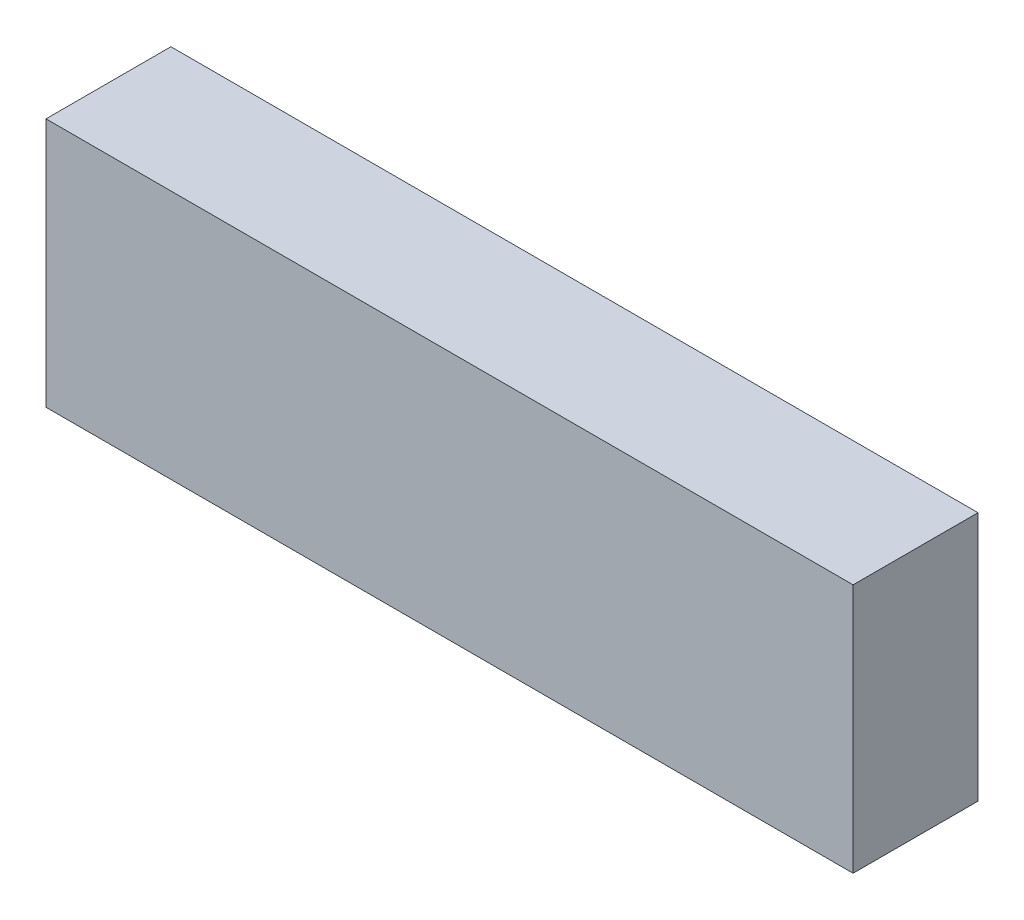
ISO-10303-21;
HEADER;
FILE_DESCRIPTION(('STEP AP214'),'2;1');
FILE_NAME('part.step','',(''),(''),'','','');
FILE_SCHEMA(('AUTOMOTIVE_DESIGN { 1 0 10303 214 1 1 1 1 }'));
ENDSEC;
DATA;
#1=APPLICATION_CONTEXT('core data for automotive mechanical design processes');
#2=APPLICATION_PROTOCOL_DEFINITION('international standard','automotive_design',2000,#1);
#3=PRODUCT_CONTEXT('',#1,'mechanical');
#4=PRODUCT('Part','Part','',(#3));
#5=PRODUCT_RELATED_PRODUCT_CATEGORY('part','',(#4));
#6=PRODUCT_DEFINITION_FORMATION('','',#4);
#7=PRODUCT_DEFINITION_CONTEXT('part definition',#1,'design');
#8=PRODUCT_DEFINITION('design','',#6,#7);
#9=PRODUCT_DEFINITION_SHAPE('','',#8);
#10=(LENGTH_UNIT() NAMED_UNIT(*) SI_UNIT(.MILLI.,.METRE.));
#11=(NAMED_UNIT(*) PLANE_ANGLE_UNIT() SI_UNIT($,.RADIAN.));
#12=(NAMED_UNIT(*) SI_UNIT($,.STERADIAN.) SOLID_ANGLE_UNIT());
#13=UNCERTAINTY_MEASURE_WITH_UNIT(LENGTH_MEASURE(1.E-05),#10,'distance_accuracy_value','');
#14=(GEOMETRIC_REPRESENTATION_CONTEXT(3) GLOBAL_UNCERTAINTY_ASSIGNED_CONTEXT((#13)) GLOBAL_UNIT_ASSIGNED_CONTEXT((#10,
#11,#12)) REPRESENTATION_CONTEXT('',''));
#15=CARTESIAN_POINT('',(0.,0.,0.));
#16=DIRECTION('',(0.,0.,1.));
#17=DIRECTION('',(1.,0.,0.));
#18=AXIS2_PLACEMENT_3D('',#15,#16,#17);
#19=CARTESIAN_POINT('',(58.10009271311,83.000046401408,0.649999952316));
#20=DIRECTION('',(0.,0.,-1.));
#21=DIRECTION('',(-1.,0.,0.));
#22=AXIS2_PLACEMENT_3D('',#19,#20,#21);
#23=PLANE('',#22);
#24=DIRECTION('',(0.,1.,0.));
#25=VECTOR('',#24,1.);
#26=CARTESIAN_POINT('',(53.900092728612,83.000046401408,0.649999952316));
#27=LINE('',#26,#25);
#28=CARTESIAN_POINT('',(53.900092728612,81.7000463763659,0.649999952316));
#29=VERTEX_POINT('',#28);
#30=CARTESIAN_POINT('',(53.9000927208609,83.000046351324,0.649999952316));
#31=VERTEX_POINT('',#30);
#32=EDGE_CURVE('E20',#29,#31,#27,.T.);
#33=ORIENTED_EDGE('',*,*,#32,.F.);
#34=DIRECTION('',(1.,1.192488069401E-08,0.));
#35=VECTOR('',#34,1.);
#36=CARTESIAN_POINT('',(58.100092728612,81.700046401408,0.649999952316));
#37=LINE('',#36,#35);
#38=CARTESIAN_POINT('',(58.1000927247367,81.700046401408,0.649999952316));
#39=VERTEX_POINT('',#38);
#40=EDGE_CURVE('E69',#39,#29,#37,.F.);
#41=ORIENTED_EDGE('',*,*,#40,.F.);
#42=DIRECTION('',(-1.192488069401E-08,1.,0.));
#43=VECTOR('',#42,1.);
#44=CARTESIAN_POINT('',(58.10009271311,83.000046401408,0.649999952316));
#45=LINE('',#44,#43);
#46=CARTESIAN_POINT('',(58.10009271311,83.0000463888873,0.649999952316));
#47=VERTEX_POINT('',#46);
#48=EDGE_CURVE('E56',#47,#39,#45,.F.);
#49=ORIENTED_EDGE('',*,*,#48,.F.);
#50=DIRECTION('',(-1.,-1.192488069401E-08,0.));
#51=VECTOR('',#50,1.);
#52=CARTESIAN_POINT('',(53.90009271311,83.000046351324,0.649999952316));
#53=LINE('',#52,#51);
#54=EDGE_CURVE('E62',#31,#47,#53,.F.);
#55=ORIENTED_EDGE('',*,*,#54,.F.);
#56=EDGE_LOOP('',(#33,#41,#49,#55));
#57=FACE_BOUND('',#56,.T.);
#58=ADVANCED_FACE('F17',(#57),#23,.F.);
#59=CARTESIAN_POINT('',(53.90009271311,83.000046351324,0.649999952316));
#60=DIRECTION('',(-1.192488069401E-08,1.,0.));
#61=DIRECTION('',(-1.,-1.192488069401E-08,0.));
#62=AXIS2_PLACEMENT_3D('',#59,#60,#61);
#63=PLANE('',#62);
#64=ORIENTED_EDGE('',*,*,#54,.T.);
#65=DIRECTION('',(0.,0.,1.));
#66=VECTOR('',#65,1.);
#67=CARTESIAN_POINT('',(58.10009271311,83.000046401408,0.649999952316));
#68=LINE('',#67,#66);
#69=CARTESIAN_POINT('',(58.10009271311,83.0000463888873,-4.76837158281198E-08));
#70=VERTEX_POINT('',#69);
#71=EDGE_CURVE('E64',#70,#47,#68,.T.);
#72=ORIENTED_EDGE('',*,*,#71,.F.);
#73=DIRECTION('',(-1.,0.,0.));
#74=VECTOR('',#73,1.);
#75=CARTESIAN_POINT('',(58.10009271311,83.000046351324,-4.768371556219E-08));
#76=LINE('',#75,#74);
#77=CARTESIAN_POINT('',(53.9000927169854,83.000046351324,-4.76837157718714E-08));
#78=VERTEX_POINT('',#77);
#79=EDGE_CURVE('E83',#78,#70,#76,.F.);
#80=ORIENTED_EDGE('',*,*,#79,.F.);
#81=DIRECTION('',(0.,0.,1.));
#82=VECTOR('',#81,1.);
#83=CARTESIAN_POINT('',(53.9000927131097,83.000046351324,0.649999952316));
#84=LINE('',#83,#82);
#85=EDGE_CURVE('E67',#31,#78,#84,.F.);
#86=ORIENTED_EDGE('',*,*,#85,.F.);
#87=EDGE_LOOP('',(#64,#72,#80,#86));
#88=FACE_BOUND('',#87,.T.);
#89=ADVANCED_FACE('F63',(#88),#63,.T.);
#90=CARTESIAN_POINT('',(58.10009271311,83.000046401408,0.649999952316));
#91=DIRECTION('',(1.,1.192488069401E-08,0.));
#92=DIRECTION('',(-1.192488069401E-08,1.,0.));
#93=AXIS2_PLACEMENT_3D('',#90,#91,#92);
#94=PLANE('',#93);
#95=ORIENTED_EDGE('',*,*,#48,.T.);
#96=DIRECTION('',(0.,0.,1.));
#97=VECTOR('',#96,1.);
#98=CARTESIAN_POINT('',(58.100092728612,81.700046401408,0.649999952316));
#99=LINE('',#98,#97);
#100=CARTESIAN_POINT('',(58.1000927247367,81.700046401408,-4.76837158100354E-08));
#101=VERTEX_POINT('',#100);
#102=EDGE_CURVE('E71',#101,#39,#99,.T.);
#103=ORIENTED_EDGE('',*,*,#102,.F.);
#104=DIRECTION('',(0.,1.,0.));
#105=VECTOR('',#104,1.);
#106=CARTESIAN_POINT('',(58.10009271311,83.000046401408,-4.768371556219E-08));
#107=LINE('',#106,#105);
#108=EDGE_CURVE('E75',#70,#101,#107,.F.);
#109=ORIENTED_EDGE('',*,*,#108,.F.);
#110=ORIENTED_EDGE('',*,*,#71,.T.);
#111=EDGE_LOOP('',(#95,#103,#109,#110));
#112=FACE_BOUND('',#111,.T.);
#113=ADVANCED_FACE('F73',(#112),#94,.T.);
#114=CARTESIAN_POINT('',(58.100092728612,81.700046401408,0.649999952316));
#115=DIRECTION('',(1.192488069401E-08,-1.,0.));
#116=DIRECTION('',(1.,1.192488069401E-08,0.));
#117=AXIS2_PLACEMENT_3D('',#114,#115,#116);
#118=PLANE('',#117);
#119=ORIENTED_EDGE('',*,*,#40,.T.);
#120=DIRECTION('',(0.,0.,1.));
#121=VECTOR('',#120,1.);
#122=CARTESIAN_POINT('',(53.900092728612,81.700046351324,0.649999952316));
#123=LINE('',#122,#121);
#124=CARTESIAN_POINT('',(53.900092728612,81.7000463638448,-4.76837157266819E-08));
#125=VERTEX_POINT('',#124);
#126=EDGE_CURVE('E35',#125,#29,#123,.T.);
#127=ORIENTED_EDGE('',*,*,#126,.F.);
#128=DIRECTION('',(-1.,0.,0.));
#129=VECTOR('',#128,1.);
#130=CARTESIAN_POINT('',(58.10009271311,81.700046401408,-4.76837155982722E-08));
#131=LINE('',#130,#129);
#132=EDGE_CURVE('E26',#101,#125,#131,.T.);
#133=ORIENTED_EDGE('',*,*,#132,.F.);
#134=ORIENTED_EDGE('',*,*,#102,.T.);
#135=EDGE_LOOP('',(#119,#127,#133,#134));
#136=FACE_BOUND('',#135,.T.);
#137=ADVANCED_FACE('F89',(#136),#118,.T.);
#138=CARTESIAN_POINT('',(53.900092728612,81.700046351324,0.649999952316));
#139=DIRECTION('',(-1.,-1.192488069401E-08,0.));
#140=DIRECTION('',(1.192488069401E-08,-1.,0.));
#141=AXIS2_PLACEMENT_3D('',#138,#139,#140);
#142=PLANE('',#141);
#143=ORIENTED_EDGE('',*,*,#32,.T.);
#144=ORIENTED_EDGE('',*,*,#85,.T.);
#145=DIRECTION('',(0.,1.,0.));
#146=VECTOR('',#145,1.);
#147=CARTESIAN_POINT('',(53.900092728612,83.000046401408,-4.76837154456166E-08));
#148=LINE('',#147,#146);
#149=EDGE_CURVE('E11',#125,#78,#148,.T.);
#150=ORIENTED_EDGE('',*,*,#149,.F.);
#151=ORIENTED_EDGE('',*,*,#126,.T.);
#152=EDGE_LOOP('',(#143,#144,#150,#151));
#153=FACE_BOUND('',#152,.T.);
#154=ADVANCED_FACE('F91',(#153),#142,.T.);
#155=CARTESIAN_POINT('',(58.10009271311,83.000046401408,-4.768371556219E-08));
#156=DIRECTION('',(0.,0.,-1.));
#157=DIRECTION('',(-1.,0.,0.));
#158=AXIS2_PLACEMENT_3D('',#155,#156,#157);
#159=PLANE('',#158);
#160=ORIENTED_EDGE('',*,*,#132,.T.);
#161=ORIENTED_EDGE('',*,*,#149,.T.);
#162=ORIENTED_EDGE('',*,*,#79,.T.);
#163=ORIENTED_EDGE('',*,*,#108,.T.);
#164=EDGE_LOOP('',(#160,#161,#162,#163));
#165=FACE_BOUND('',#164,.T.);
#166=ADVANCED_FACE('F88',(#165),#159,.T.);
#167=CLOSED_SHELL('',(#58,#89,#113,#137,#154,#166));
#168=MANIFOLD_SOLID_BREP('B1',#167);
#169=ADVANCED_BREP_SHAPE_REPRESENTATION('',(#18,#168),#14);
#170=SHAPE_DEFINITION_REPRESENTATION(#9,#169);
ENDSEC;
END-ISO-10303-21;
